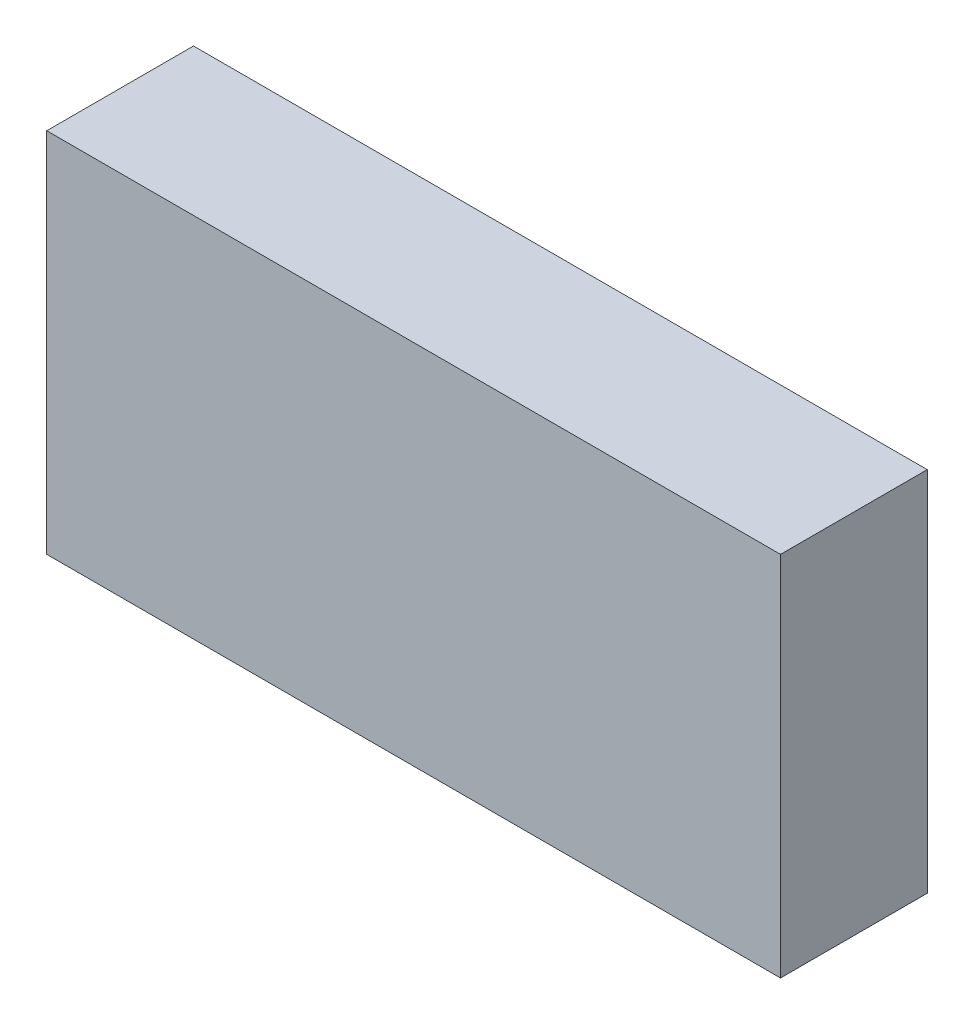
ISO-10303-21;
HEADER;
FILE_DESCRIPTION(('STEP AP214'),'2;1');
FILE_NAME('part.step','',(''),(''),'','','');
FILE_SCHEMA(('AUTOMOTIVE_DESIGN { 1 0 10303 214 1 1 1 1 }'));
ENDSEC;
DATA;
#1=APPLICATION_CONTEXT('core data for automotive mechanical design processes');
#2=APPLICATION_PROTOCOL_DEFINITION('international standard','automotive_design',2000,#1);
#3=PRODUCT_CONTEXT('',#1,'mechanical');
#4=PRODUCT('Part','Part','',(#3));
#5=PRODUCT_RELATED_PRODUCT_CATEGORY('part','',(#4));
#6=PRODUCT_DEFINITION_FORMATION('','',#4);
#7=PRODUCT_DEFINITION_CONTEXT('part definition',#1,'design');
#8=PRODUCT_DEFINITION('design','',#6,#7);
#9=PRODUCT_DEFINITION_SHAPE('','',#8);
#10=(LENGTH_UNIT() NAMED_UNIT(*) SI_UNIT(.MILLI.,.METRE.));
#11=(NAMED_UNIT(*) PLANE_ANGLE_UNIT() SI_UNIT($,.RADIAN.));
#12=(NAMED_UNIT(*) SI_UNIT($,.STERADIAN.) SOLID_ANGLE_UNIT());
#13=UNCERTAINTY_MEASURE_WITH_UNIT(LENGTH_MEASURE(1.E-05),#10,'distance_accuracy_value','');
#14=(GEOMETRIC_REPRESENTATION_CONTEXT(3) GLOBAL_UNCERTAINTY_ASSIGNED_CONTEXT((#13)) GLOBAL_UNIT_ASSIGNED_CONTEXT((#10,
#11,#12)) REPRESENTATION_CONTEXT('',''));
#15=CARTESIAN_POINT('',(0.,0.,0.));
#16=DIRECTION('',(0.,0.,1.));
#17=DIRECTION('',(1.,0.,0.));
#18=AXIS2_PLACEMENT_3D('',#15,#16,#17);
#19=CARTESIAN_POINT('',(-30.,-15.,-12.));
#20=DIRECTION('',(-1.,0.,0.));
#21=DIRECTION('',(0.,0.,1.));
#22=AXIS2_PLACEMENT_3D('',#19,#20,#21);
#23=PLANE('',#22);
#24=DIRECTION('',(0.,-1.,0.));
#25=VECTOR('',#24,1.);
#26=CARTESIAN_POINT('',(-30.,-15.,0.));
#27=LINE('',#26,#25);
#28=CARTESIAN_POINT('',(-30.,15.,0.));
#29=VERTEX_POINT('',#28);
#30=CARTESIAN_POINT('',(-30.,-15.,0.));
#31=VERTEX_POINT('',#30);
#32=EDGE_CURVE('E99',#29,#31,#27,.T.);
#33=ORIENTED_EDGE('',*,*,#32,.F.);
#34=DIRECTION('',(0.,0.,1.));
#35=VECTOR('',#34,1.);
#36=CARTESIAN_POINT('',(-30.,15.,-12.));
#37=LINE('',#36,#35);
#38=CARTESIAN_POINT('',(-30.,15.,-12.));
#39=VERTEX_POINT('',#38);
#40=EDGE_CURVE('E11',#39,#29,#37,.T.);
#41=ORIENTED_EDGE('',*,*,#40,.F.);
#42=DIRECTION('',(0.,-1.,0.));
#43=VECTOR('',#42,1.);
#44=CARTESIAN_POINT('',(-30.,-15.,-12.));
#45=LINE('',#44,#43);
#46=CARTESIAN_POINT('',(-30.,-15.,-12.));
#47=VERTEX_POINT('',#46);
#48=EDGE_CURVE('E93',#39,#47,#45,.T.);
#49=ORIENTED_EDGE('',*,*,#48,.T.);
#50=DIRECTION('',(0.,0.,1.));
#51=VECTOR('',#50,1.);
#52=CARTESIAN_POINT('',(-30.,-15.,-12.));
#53=LINE('',#52,#51);
#54=EDGE_CURVE('E38',#47,#31,#53,.T.);
#55=ORIENTED_EDGE('',*,*,#54,.T.);
#56=EDGE_LOOP('',(#33,#41,#49,#55));
#57=FACE_BOUND('',#56,.T.);
#58=ADVANCED_FACE('F35',(#57),#23,.T.);
#59=CARTESIAN_POINT('',(30.,15.,-12.));
#60=DIRECTION('',(0.,1.,0.));
#61=DIRECTION('',(-1.,0.,0.));
#62=AXIS2_PLACEMENT_3D('',#59,#60,#61);
#63=PLANE('',#62);
#64=DIRECTION('',(-1.,0.,0.));
#65=VECTOR('',#64,1.);
#66=CARTESIAN_POINT('',(30.,15.,0.));
#67=LINE('',#66,#65);
#68=CARTESIAN_POINT('',(30.,15.,0.));
#69=VERTEX_POINT('',#68);
#70=EDGE_CURVE('E95',#69,#29,#67,.T.);
#71=ORIENTED_EDGE('',*,*,#70,.F.);
#72=DIRECTION('',(0.,0.,1.));
#73=VECTOR('',#72,1.);
#74=CARTESIAN_POINT('',(30.,15.,-12.));
#75=LINE('',#74,#73);
#76=CARTESIAN_POINT('',(30.,15.,-12.));
#77=VERTEX_POINT('',#76);
#78=EDGE_CURVE('E44',#77,#69,#75,.T.);
#79=ORIENTED_EDGE('',*,*,#78,.F.);
#80=DIRECTION('',(-1.,0.,0.));
#81=VECTOR('',#80,1.);
#82=CARTESIAN_POINT('',(30.,15.,-12.));
#83=LINE('',#82,#81);
#84=EDGE_CURVE('E90',#77,#39,#83,.T.);
#85=ORIENTED_EDGE('',*,*,#84,.T.);
#86=ORIENTED_EDGE('',*,*,#40,.T.);
#87=EDGE_LOOP('',(#71,#79,#85,#86));
#88=FACE_BOUND('',#87,.T.);
#89=ADVANCED_FACE('F109',(#88),#63,.T.);
#90=CARTESIAN_POINT('',(30.,-15.,-12.));
#91=DIRECTION('',(1.,0.,0.));
#92=DIRECTION('',(0.,0.,-1.));
#93=AXIS2_PLACEMENT_3D('',#90,#91,#92);
#94=PLANE('',#93);
#95=DIRECTION('',(0.,1.,0.));
#96=VECTOR('',#95,1.);
#97=CARTESIAN_POINT('',(30.,-15.,0.));
#98=LINE('',#97,#96);
#99=CARTESIAN_POINT('',(30.,-15.,0.));
#100=VERTEX_POINT('',#99);
#101=EDGE_CURVE('E85',#100,#69,#98,.T.);
#102=ORIENTED_EDGE('',*,*,#101,.F.);
#103=DIRECTION('',(0.,0.,1.));
#104=VECTOR('',#103,1.);
#105=CARTESIAN_POINT('',(30.,-15.,-12.));
#106=LINE('',#105,#104);
#107=CARTESIAN_POINT('',(30.,-15.,-12.));
#108=VERTEX_POINT('',#107);
#109=EDGE_CURVE('E80',#108,#100,#106,.T.);
#110=ORIENTED_EDGE('',*,*,#109,.F.);
#111=DIRECTION('',(0.,1.,0.));
#112=VECTOR('',#111,1.);
#113=CARTESIAN_POINT('',(30.,-15.,-12.));
#114=LINE('',#113,#112);
#115=EDGE_CURVE('E83',#108,#77,#114,.T.);
#116=ORIENTED_EDGE('',*,*,#115,.T.);
#117=ORIENTED_EDGE('',*,*,#78,.T.);
#118=EDGE_LOOP('',(#102,#110,#116,#117));
#119=FACE_BOUND('',#118,.T.);
#120=ADVANCED_FACE('F82',(#119),#94,.T.);
#121=CARTESIAN_POINT('',(30.,-15.,-12.));
#122=DIRECTION('',(0.,-1.,0.));
#123=DIRECTION('',(1.,0.,0.));
#124=AXIS2_PLACEMENT_3D('',#121,#122,#123);
#125=PLANE('',#124);
#126=DIRECTION('',(1.,0.,0.));
#127=VECTOR('',#126,1.);
#128=CARTESIAN_POINT('',(30.,-15.,0.));
#129=LINE('',#128,#127);
#130=EDGE_CURVE('E102',#31,#100,#129,.T.);
#131=ORIENTED_EDGE('',*,*,#130,.F.);
#132=ORIENTED_EDGE('',*,*,#54,.F.);
#133=DIRECTION('',(1.,0.,0.));
#134=VECTOR('',#133,1.);
#135=CARTESIAN_POINT('',(30.,-15.,-12.));
#136=LINE('',#135,#134);
#137=EDGE_CURVE('E89',#47,#108,#136,.T.);
#138=ORIENTED_EDGE('',*,*,#137,.T.);
#139=ORIENTED_EDGE('',*,*,#109,.T.);
#140=EDGE_LOOP('',(#131,#132,#138,#139));
#141=FACE_BOUND('',#140,.T.);
#142=ADVANCED_FACE('F92',(#141),#125,.T.);
#143=CARTESIAN_POINT('',(0.,0.,-12.));
#144=DIRECTION('',(0.,0.,1.));
#145=DIRECTION('',(1.,0.,0.));
#146=AXIS2_PLACEMENT_3D('',#143,#144,#145);
#147=PLANE('',#146);
#148=ORIENTED_EDGE('',*,*,#48,.F.);
#149=ORIENTED_EDGE('',*,*,#84,.F.);
#150=ORIENTED_EDGE('',*,*,#115,.F.);
#151=ORIENTED_EDGE('',*,*,#137,.F.);
#152=EDGE_LOOP('',(#148,#149,#150,#151));
#153=FACE_BOUND('',#152,.T.);
#154=ADVANCED_FACE('F88',(#153),#147,.F.);
#155=CARTESIAN_POINT('',(0.,0.,0.));
#156=DIRECTION('',(0.,0.,1.));
#157=DIRECTION('',(1.,0.,0.));
#158=AXIS2_PLACEMENT_3D('',#155,#156,#157);
#159=PLANE('',#158);
#160=ORIENTED_EDGE('',*,*,#32,.T.);
#161=ORIENTED_EDGE('',*,*,#130,.T.);
#162=ORIENTED_EDGE('',*,*,#101,.T.);
#163=ORIENTED_EDGE('',*,*,#70,.T.);
#164=EDGE_LOOP('',(#160,#161,#162,#163));
#165=FACE_BOUND('',#164,.T.);
#166=ADVANCED_FACE('F108',(#165),#159,.T.);
#167=CLOSED_SHELL('',(#58,#89,#120,#142,#154,#166));
#168=MANIFOLD_SOLID_BREP('B2',#167);
#169=ADVANCED_BREP_SHAPE_REPRESENTATION('',(#18,#168),#14);
#170=SHAPE_DEFINITION_REPRESENTATION(#9,#169);
ENDSEC;
END-ISO-10303-21;
